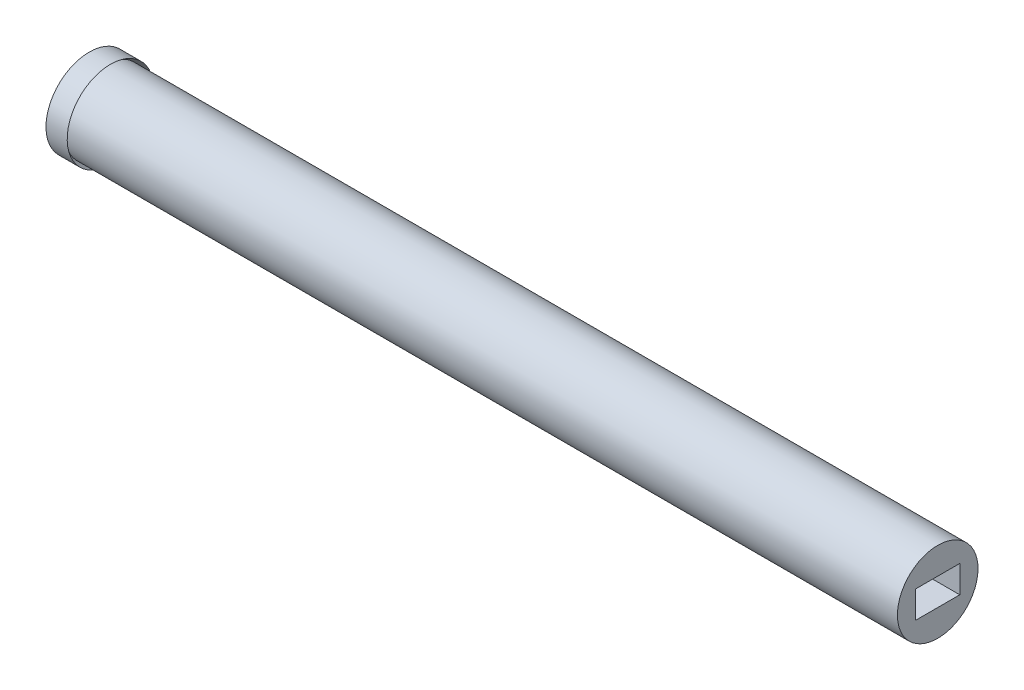
ISO-10303-21;
HEADER;
FILE_DESCRIPTION(('STEP AP214'),'2;1');
FILE_NAME('part.step','',(''),(''),'','','');
FILE_SCHEMA(('AUTOMOTIVE_DESIGN { 1 0 10303 214 1 1 1 1 }'));
ENDSEC;
DATA;
#1=APPLICATION_CONTEXT('core data for automotive mechanical design processes');
#2=APPLICATION_PROTOCOL_DEFINITION('international standard','automotive_design',2000,#1);
#3=PRODUCT_CONTEXT('',#1,'mechanical');
#4=PRODUCT('Part','Part','',(#3));
#5=PRODUCT_RELATED_PRODUCT_CATEGORY('part','',(#4));
#6=PRODUCT_DEFINITION_FORMATION('','',#4);
#7=PRODUCT_DEFINITION_CONTEXT('part definition',#1,'design');
#8=PRODUCT_DEFINITION('design','',#6,#7);
#9=PRODUCT_DEFINITION_SHAPE('','',#8);
#10=(LENGTH_UNIT() NAMED_UNIT(*) SI_UNIT(.MILLI.,.METRE.));
#11=(NAMED_UNIT(*) PLANE_ANGLE_UNIT() SI_UNIT($,.RADIAN.));
#12=(NAMED_UNIT(*) SI_UNIT($,.STERADIAN.) SOLID_ANGLE_UNIT());
#13=UNCERTAINTY_MEASURE_WITH_UNIT(LENGTH_MEASURE(1.E-05),#10,'distance_accuracy_value','');
#14=(GEOMETRIC_REPRESENTATION_CONTEXT(3) GLOBAL_UNCERTAINTY_ASSIGNED_CONTEXT((#13)) GLOBAL_UNIT_ASSIGNED_CONTEXT((#10,
#11,#12)) REPRESENTATION_CONTEXT('',''));
#15=CARTESIAN_POINT('',(0.,0.,0.));
#16=DIRECTION('',(0.,0.,1.));
#17=DIRECTION('',(1.,0.,0.));
#18=AXIS2_PLACEMENT_3D('',#15,#16,#17);
#19=CARTESIAN_POINT('',(0.,5.10000000000001,0.));
#20=DIRECTION('',(1.,0.,0.));
#21=DIRECTION('',(0.,1.,0.));
#22=AXIS2_PLACEMENT_3D('',#19,#20,#21);
#23=PLANE('',#22);
#24=CARTESIAN_POINT('',(0.,5.10000000000001,0.));
#25=DIRECTION('',(1.,0.,0.));
#26=DIRECTION('',(0.,1.,0.));
#27=AXIS2_PLACEMENT_3D('',#24,#25,#26);
#28=CIRCLE('',#27,5.10000000000001);
#29=CARTESIAN_POINT('',(0.,10.2,0.));
#30=VERTEX_POINT('',#29);
#31=EDGE_CURVE('E11',#30,#30,#28,.T.);
#32=ORIENTED_EDGE('',*,*,#31,.F.);
#33=EDGE_LOOP('',(#32));
#34=FACE_BOUND('',#33,.T.);
#35=ADVANCED_FACE('F49',(#34),#23,.F.);
#36=CARTESIAN_POINT('',(100.,5.10000000000002,0.));
#37=DIRECTION('',(1.,0.,0.));
#38=DIRECTION('',(0.,1.,0.));
#39=AXIS2_PLACEMENT_3D('',#36,#37,#38);
#40=CYLINDRICAL_SURFACE('',#39,5.10000000000001);
#41=CARTESIAN_POINT('',(2.5,5.10000000000001,0.));
#42=DIRECTION('',(1.,0.,0.));
#43=DIRECTION('',(0.,1.,0.));
#44=AXIS2_PLACEMENT_3D('',#41,#42,#43);
#45=CIRCLE('',#44,5.10000000000001);
#46=CARTESIAN_POINT('',(2.5,10.2,0.));
#47=VERTEX_POINT('',#46);
#48=EDGE_CURVE('E57',#47,#47,#45,.T.);
#49=ORIENTED_EDGE('',*,*,#48,.F.);
#50=EDGE_LOOP('',(#49));
#51=FACE_BOUND('',#50,.T.);
#52=ORIENTED_EDGE('',*,*,#31,.T.);
#53=EDGE_LOOP('',(#52));
#54=FACE_BOUND('',#53,.T.);
#55=ADVANCED_FACE('F154',(#51,#54),#40,.T.);
#56=CARTESIAN_POINT('',(2.5,5.10000000000001,0.));
#57=DIRECTION('',(1.,0.,0.));
#58=DIRECTION('',(0.,1.,0.));
#59=AXIS2_PLACEMENT_3D('',#56,#57,#58);
#60=CONICAL_SURFACE('',#59,5.10000000000001,0.523598775598338);
#61=CARTESIAN_POINT('',(1.89378221735091,5.10000000000001,0.));
#62=DIRECTION('',(1.,0.,0.));
#63=DIRECTION('',(0.,1.,0.));
#64=AXIS2_PLACEMENT_3D('',#61,#62,#63);
#65=CIRCLE('',#64,4.74999999999999);
#66=CARTESIAN_POINT('',(1.89378221735091,9.85,0.));
#67=VERTEX_POINT('',#66);
#68=EDGE_CURVE('E144',#67,#67,#65,.T.);
#69=ORIENTED_EDGE('',*,*,#68,.F.);
#70=EDGE_LOOP('',(#69));
#71=FACE_BOUND('',#70,.T.);
#72=ORIENTED_EDGE('',*,*,#48,.T.);
#73=EDGE_LOOP('',(#72));
#74=FACE_BOUND('',#73,.T.);
#75=ADVANCED_FACE('F152',(#71,#74),#60,.F.);
#76=CARTESIAN_POINT('',(100.,5.10000000000002,0.));
#77=DIRECTION('',(1.,0.,0.));
#78=DIRECTION('',(0.,1.,0.));
#79=AXIS2_PLACEMENT_3D('',#76,#77,#78);
#80=CYLINDRICAL_SURFACE('',#79,4.74999999999999);
#81=CARTESIAN_POINT('',(100.,5.10000000000002,0.));
#82=DIRECTION('',(1.,0.,0.));
#83=DIRECTION('',(0.,1.,0.));
#84=AXIS2_PLACEMENT_3D('',#81,#82,#83);
#85=CIRCLE('',#84,4.75);
#86=CARTESIAN_POINT('',(100.,9.85000000000002,0.));
#87=VERTEX_POINT('',#86);
#88=EDGE_CURVE('E136',#87,#87,#85,.T.);
#89=ORIENTED_EDGE('',*,*,#88,.F.);
#90=EDGE_LOOP('',(#89));
#91=FACE_BOUND('',#90,.T.);
#92=ORIENTED_EDGE('',*,*,#68,.T.);
#93=EDGE_LOOP('',(#92));
#94=FACE_BOUND('',#93,.T.);
#95=ADVANCED_FACE('F174',(#91,#94),#80,.T.);
#96=CARTESIAN_POINT('',(100.,0.350000000000023,0.));
#97=DIRECTION('',(-1.,0.,0.));
#98=DIRECTION('',(0.,-1.,0.));
#99=AXIS2_PLACEMENT_3D('',#96,#97,#98);
#100=PLANE('',#99);
#101=DIRECTION('',(0.,0.,-1.));
#102=VECTOR('',#101,1.);
#103=CARTESIAN_POINT('',(100.,3.50000000000002,2.6));
#104=LINE('',#103,#102);
#105=CARTESIAN_POINT('',(100.,3.50000000000002,2.6));
#106=VERTEX_POINT('',#105);
#107=CARTESIAN_POINT('',(100.,3.50000000000002,-2.6));
#108=VERTEX_POINT('',#107);
#109=EDGE_CURVE('E99',#106,#108,#104,.T.);
#110=ORIENTED_EDGE('',*,*,#109,.F.);
#111=DIRECTION('',(0.,-1.,0.));
#112=VECTOR('',#111,1.);
#113=CARTESIAN_POINT('',(100.,6.70000000000002,2.6));
#114=LINE('',#113,#112);
#115=CARTESIAN_POINT('',(100.,6.70000000000002,2.6));
#116=VERTEX_POINT('',#115);
#117=EDGE_CURVE('E64',#116,#106,#114,.T.);
#118=ORIENTED_EDGE('',*,*,#117,.F.);
#119=DIRECTION('',(0.,0.,1.));
#120=VECTOR('',#119,1.);
#121=CARTESIAN_POINT('',(100.,6.70000000000002,2.6));
#122=LINE('',#121,#120);
#123=CARTESIAN_POINT('',(100.,6.70000000000002,-2.6));
#124=VERTEX_POINT('',#123);
#125=EDGE_CURVE('E120',#124,#116,#122,.T.);
#126=ORIENTED_EDGE('',*,*,#125,.F.);
#127=DIRECTION('',(0.,1.,0.));
#128=VECTOR('',#127,1.);
#129=CARTESIAN_POINT('',(100.,6.70000000000002,-2.6));
#130=LINE('',#129,#128);
#131=EDGE_CURVE('E129',#108,#124,#130,.T.);
#132=ORIENTED_EDGE('',*,*,#131,.F.);
#133=EDGE_LOOP('',(#110,#118,#126,#132));
#134=FACE_BOUND('',#133,.T.);
#135=ORIENTED_EDGE('',*,*,#88,.T.);
#136=EDGE_LOOP('',(#135));
#137=FACE_BOUND('',#136,.T.);
#138=ADVANCED_FACE('F183',(#134,#137),#100,.F.);
#139=CARTESIAN_POINT('',(95.7,6.70000000000002,2.6));
#140=DIRECTION('',(0.,0.,1.));
#141=DIRECTION('',(0.,-1.,0.));
#142=AXIS2_PLACEMENT_3D('',#139,#140,#141);
#143=PLANE('',#142);
#144=ORIENTED_EDGE('',*,*,#117,.T.);
#145=DIRECTION('',(1.,0.,0.));
#146=VECTOR('',#145,1.);
#147=CARTESIAN_POINT('',(95.7,3.50000000000002,2.6));
#148=LINE('',#147,#146);
#149=CARTESIAN_POINT('',(95.7,3.50000000000002,2.6));
#150=VERTEX_POINT('',#149);
#151=EDGE_CURVE('E87',#150,#106,#148,.T.);
#152=ORIENTED_EDGE('',*,*,#151,.F.);
#153=DIRECTION('',(0.,-1.,0.));
#154=VECTOR('',#153,1.);
#155=CARTESIAN_POINT('',(95.7,6.70000000000002,2.6));
#156=LINE('',#155,#154);
#157=CARTESIAN_POINT('',(95.7,6.70000000000002,2.6));
#158=VERTEX_POINT('',#157);
#159=EDGE_CURVE('E115',#158,#150,#156,.T.);
#160=ORIENTED_EDGE('',*,*,#159,.F.);
#161=DIRECTION('',(1.,0.,0.));
#162=VECTOR('',#161,1.);
#163=CARTESIAN_POINT('',(95.7,6.70000000000002,2.6));
#164=LINE('',#163,#162);
#165=EDGE_CURVE('E72',#158,#116,#164,.T.);
#166=ORIENTED_EDGE('',*,*,#165,.T.);
#167=EDGE_LOOP('',(#144,#152,#160,#166));
#168=FACE_BOUND('',#167,.T.);
#169=ADVANCED_FACE('F192',(#168),#143,.F.);
#170=CARTESIAN_POINT('',(95.7,6.70000000000002,2.6));
#171=DIRECTION('',(0.,1.,0.));
#172=DIRECTION('',(-1.,0.,0.));
#173=AXIS2_PLACEMENT_3D('',#170,#171,#172);
#174=PLANE('',#173);
#175=ORIENTED_EDGE('',*,*,#125,.T.);
#176=ORIENTED_EDGE('',*,*,#165,.F.);
#177=DIRECTION('',(0.,0.,1.));
#178=VECTOR('',#177,1.);
#179=CARTESIAN_POINT('',(95.7,6.70000000000002,2.6));
#180=LINE('',#179,#178);
#181=CARTESIAN_POINT('',(95.7,6.70000000000002,-2.6));
#182=VERTEX_POINT('',#181);
#183=EDGE_CURVE('E112',#182,#158,#180,.T.);
#184=ORIENTED_EDGE('',*,*,#183,.F.);
#185=DIRECTION('',(1.,0.,0.));
#186=VECTOR('',#185,1.);
#187=CARTESIAN_POINT('',(95.7,6.70000000000002,-2.6));
#188=LINE('',#187,#186);
#189=EDGE_CURVE('E104',#182,#124,#188,.T.);
#190=ORIENTED_EDGE('',*,*,#189,.T.);
#191=EDGE_LOOP('',(#175,#176,#184,#190));
#192=FACE_BOUND('',#191,.T.);
#193=ADVANCED_FACE('F201',(#192),#174,.F.);
#194=CARTESIAN_POINT('',(95.7,6.70000000000002,-2.6));
#195=DIRECTION('',(0.,0.,-1.));
#196=DIRECTION('',(0.,1.,0.));
#197=AXIS2_PLACEMENT_3D('',#194,#195,#196);
#198=PLANE('',#197);
#199=ORIENTED_EDGE('',*,*,#131,.T.);
#200=ORIENTED_EDGE('',*,*,#189,.F.);
#201=DIRECTION('',(0.,1.,0.));
#202=VECTOR('',#201,1.);
#203=CARTESIAN_POINT('',(95.7,6.70000000000002,-2.6));
#204=LINE('',#203,#202);
#205=CARTESIAN_POINT('',(95.7,3.50000000000002,-2.6));
#206=VERTEX_POINT('',#205);
#207=EDGE_CURVE('E107',#206,#182,#204,.T.);
#208=ORIENTED_EDGE('',*,*,#207,.F.);
#209=DIRECTION('',(1.,0.,0.));
#210=VECTOR('',#209,1.);
#211=CARTESIAN_POINT('',(95.7,3.50000000000002,-2.6));
#212=LINE('',#211,#210);
#213=EDGE_CURVE('E92',#206,#108,#212,.T.);
#214=ORIENTED_EDGE('',*,*,#213,.T.);
#215=EDGE_LOOP('',(#199,#200,#208,#214));
#216=FACE_BOUND('',#215,.T.);
#217=ADVANCED_FACE('F108',(#216),#198,.F.);
#218=CARTESIAN_POINT('',(95.7,3.50000000000002,2.6));
#219=DIRECTION('',(0.,-1.,0.));
#220=DIRECTION('',(1.,0.,0.));
#221=AXIS2_PLACEMENT_3D('',#218,#219,#220);
#222=PLANE('',#221);
#223=ORIENTED_EDGE('',*,*,#109,.T.);
#224=ORIENTED_EDGE('',*,*,#213,.F.);
#225=DIRECTION('',(0.,0.,-1.));
#226=VECTOR('',#225,1.);
#227=CARTESIAN_POINT('',(95.7,3.50000000000002,2.6));
#228=LINE('',#227,#226);
#229=EDGE_CURVE('E96',#150,#206,#228,.T.);
#230=ORIENTED_EDGE('',*,*,#229,.F.);
#231=ORIENTED_EDGE('',*,*,#151,.T.);
#232=EDGE_LOOP('',(#223,#224,#230,#231));
#233=FACE_BOUND('',#232,.T.);
#234=ADVANCED_FACE('F94',(#233),#222,.F.);
#235=CARTESIAN_POINT('',(95.7,0.,0.));
#236=DIRECTION('',(1.,0.,0.));
#237=DIRECTION('',(0.,0.,-1.));
#238=AXIS2_PLACEMENT_3D('',#235,#236,#237);
#239=PLANE('',#238);
#240=ORIENTED_EDGE('',*,*,#159,.T.);
#241=ORIENTED_EDGE('',*,*,#229,.T.);
#242=ORIENTED_EDGE('',*,*,#207,.T.);
#243=ORIENTED_EDGE('',*,*,#183,.T.);
#244=EDGE_LOOP('',(#240,#241,#242,#243));
#245=FACE_BOUND('',#244,.T.);
#246=ADVANCED_FACE('F114',(#245),#239,.T.);
#247=CLOSED_SHELL('',(#35,#55,#75,#95,#138,#169,#193,#217,#234,#246));
#248=MANIFOLD_SOLID_BREP('B2',#247);
#249=ADVANCED_BREP_SHAPE_REPRESENTATION('',(#18,#248),#14);
#250=SHAPE_DEFINITION_REPRESENTATION(#9,#249);
ENDSEC;
END-ISO-10303-21;
